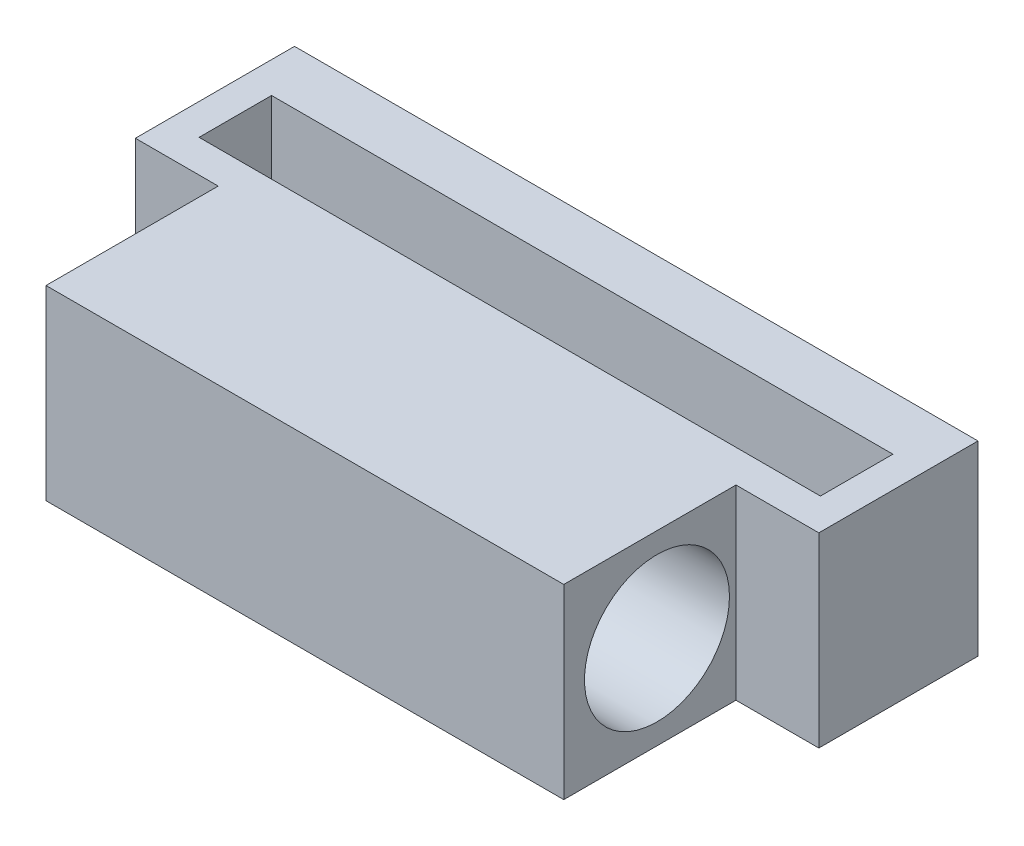
ISO-10303-21;
HEADER;
FILE_DESCRIPTION(('STEP AP214'),'2;1');
FILE_NAME('part.step','',(''),(''),'','','');
FILE_SCHEMA(('AUTOMOTIVE_DESIGN { 1 0 10303 214 1 1 1 1 }'));
ENDSEC;
DATA;
#1=APPLICATION_CONTEXT('core data for automotive mechanical design processes');
#2=APPLICATION_PROTOCOL_DEFINITION('international standard','automotive_design',2000,#1);
#3=PRODUCT_CONTEXT('',#1,'mechanical');
#4=PRODUCT('Part','Part','',(#3));
#5=PRODUCT_RELATED_PRODUCT_CATEGORY('part','',(#4));
#6=PRODUCT_DEFINITION_FORMATION('','',#4);
#7=PRODUCT_DEFINITION_CONTEXT('part definition',#1,'design');
#8=PRODUCT_DEFINITION('design','',#6,#7);
#9=PRODUCT_DEFINITION_SHAPE('','',#8);
#10=(LENGTH_UNIT() NAMED_UNIT(*) SI_UNIT(.MILLI.,.METRE.));
#11=(NAMED_UNIT(*) PLANE_ANGLE_UNIT() SI_UNIT($,.RADIAN.));
#12=(NAMED_UNIT(*) SI_UNIT($,.STERADIAN.) SOLID_ANGLE_UNIT());
#13=UNCERTAINTY_MEASURE_WITH_UNIT(LENGTH_MEASURE(1.E-05),#10,'distance_accuracy_value','');
#14=(GEOMETRIC_REPRESENTATION_CONTEXT(3) GLOBAL_UNCERTAINTY_ASSIGNED_CONTEXT((#13)) GLOBAL_UNIT_ASSIGNED_CONTEXT((#10,
#11,#12)) REPRESENTATION_CONTEXT('',''));
#15=CARTESIAN_POINT('',(0.,0.,0.));
#16=DIRECTION('',(0.,0.,1.));
#17=DIRECTION('',(1.,0.,0.));
#18=AXIS2_PLACEMENT_3D('',#15,#16,#17);
#19=CARTESIAN_POINT('',(0.,9.,0.));
#20=DIRECTION('',(1.,0.,0.));
#21=DIRECTION('',(0.,0.,-1.));
#22=AXIS2_PLACEMENT_3D('',#19,#20,#21);
#23=PLANE('',#22);
#24=CARTESIAN_POINT('',(0.,4.5,-4.5));
#25=DIRECTION('',(1.,0.,0.));
#26=DIRECTION('',(0.,0.,-1.));
#27=AXIS2_PLACEMENT_3D('',#24,#25,#26);
#28=CIRCLE('',#27,3.5);
#29=CARTESIAN_POINT('',(0.,4.5,-8.));
#30=VERTEX_POINT('',#29);
#31=EDGE_CURVE('E194',#30,#30,#28,.T.);
#32=ORIENTED_EDGE('',*,*,#31,.T.);
#33=EDGE_LOOP('',(#32));
#34=FACE_BOUND('',#33,.T.);
#35=DIRECTION('',(0.,0.,1.));
#36=VECTOR('',#35,1.);
#37=CARTESIAN_POINT('',(0.,9.,0.));
#38=LINE('',#37,#36);
#39=CARTESIAN_POINT('',(0.,9.,-8.31499990127327));
#40=VERTEX_POINT('',#39);
#41=CARTESIAN_POINT('',(0.,9.,0.));
#42=VERTEX_POINT('',#41);
#43=EDGE_CURVE('E200',#40,#42,#38,.T.);
#44=ORIENTED_EDGE('',*,*,#43,.F.);
#45=DIRECTION('',(0.,-1.,0.));
#46=VECTOR('',#45,1.);
#47=CARTESIAN_POINT('',(0.,9.,-8.31499990127327));
#48=LINE('',#47,#46);
#49=CARTESIAN_POINT('',(0.,0.,-8.31499990127327));
#50=VERTEX_POINT('',#49);
#51=EDGE_CURVE('E190',#40,#50,#48,.T.);
#52=ORIENTED_EDGE('',*,*,#51,.T.);
#53=DIRECTION('',(0.,0.,1.));
#54=VECTOR('',#53,1.);
#55=CARTESIAN_POINT('',(0.,0.,0.));
#56=LINE('',#55,#54);
#57=CARTESIAN_POINT('',(0.,0.,0.));
#58=VERTEX_POINT('',#57);
#59=EDGE_CURVE('E197',#50,#58,#56,.T.);
#60=ORIENTED_EDGE('',*,*,#59,.T.);
#61=DIRECTION('',(0.,-1.,0.));
#62=VECTOR('',#61,1.);
#63=CARTESIAN_POINT('',(0.,9.,0.));
#64=LINE('',#63,#62);
#65=EDGE_CURVE('E11',#42,#58,#64,.T.);
#66=ORIENTED_EDGE('',*,*,#65,.F.);
#67=EDGE_LOOP('',(#44,#52,#60,#66));
#68=FACE_BOUND('',#67,.T.);
#69=ADVANCED_FACE('F32',(#34,#68),#23,.F.);
#70=CARTESIAN_POINT('',(0.,9.,0.));
#71=DIRECTION('',(0.,0.,-1.));
#72=DIRECTION('',(-1.,0.,0.));
#73=AXIS2_PLACEMENT_3D('',#70,#71,#72);
#74=PLANE('',#73);
#75=DIRECTION('',(1.,0.,0.));
#76=VECTOR('',#75,1.);
#77=CARTESIAN_POINT('',(0.,0.,0.));
#78=LINE('',#77,#76);
#79=CARTESIAN_POINT('',(25.,0.,0.));
#80=VERTEX_POINT('',#79);
#81=EDGE_CURVE('E211',#58,#80,#78,.T.);
#82=ORIENTED_EDGE('',*,*,#81,.T.);
#83=DIRECTION('',(0.,-1.,0.));
#84=VECTOR('',#83,1.);
#85=CARTESIAN_POINT('',(25.,9.,0.));
#86=LINE('',#85,#84);
#87=CARTESIAN_POINT('',(25.,9.,0.));
#88=VERTEX_POINT('',#87);
#89=EDGE_CURVE('E39',#88,#80,#86,.T.);
#90=ORIENTED_EDGE('',*,*,#89,.F.);
#91=DIRECTION('',(1.,0.,0.));
#92=VECTOR('',#91,1.);
#93=CARTESIAN_POINT('',(0.,9.,0.));
#94=LINE('',#93,#92);
#95=EDGE_CURVE('E202',#42,#88,#94,.T.);
#96=ORIENTED_EDGE('',*,*,#95,.F.);
#97=ORIENTED_EDGE('',*,*,#65,.T.);
#98=EDGE_LOOP('',(#82,#90,#96,#97));
#99=FACE_BOUND('',#98,.T.);
#100=ADVANCED_FACE('F235',(#99),#74,.F.);
#101=CARTESIAN_POINT('',(25.,9.,0.));
#102=DIRECTION('',(-1.,0.,0.));
#103=DIRECTION('',(0.,0.,1.));
#104=AXIS2_PLACEMENT_3D('',#101,#102,#103);
#105=PLANE('',#104);
#106=CARTESIAN_POINT('',(25.,4.5,-4.5));
#107=DIRECTION('',(1.,0.,0.));
#108=DIRECTION('',(0.,0.,-1.));
#109=AXIS2_PLACEMENT_3D('',#106,#107,#108);
#110=CIRCLE('',#109,3.5);
#111=CARTESIAN_POINT('',(25.,4.5,-8.));
#112=VERTEX_POINT('',#111);
#113=EDGE_CURVE('E193',#112,#112,#110,.T.);
#114=ORIENTED_EDGE('',*,*,#113,.F.);
#115=EDGE_LOOP('',(#114));
#116=FACE_BOUND('',#115,.T.);
#117=DIRECTION('',(0.,0.,-1.));
#118=VECTOR('',#117,1.);
#119=CARTESIAN_POINT('',(25.,0.,0.));
#120=LINE('',#119,#118);
#121=CARTESIAN_POINT('',(25.,0.,-8.31499990127327));
#122=VERTEX_POINT('',#121);
#123=EDGE_CURVE('E213',#80,#122,#120,.T.);
#124=ORIENTED_EDGE('',*,*,#123,.T.);
#125=DIRECTION('',(0.,1.,0.));
#126=VECTOR('',#125,1.);
#127=CARTESIAN_POINT('',(25.,9.,-8.31499990127327));
#128=LINE('',#127,#126);
#129=CARTESIAN_POINT('',(25.,9.,-8.31499990127327));
#130=VERTEX_POINT('',#129);
#131=EDGE_CURVE('E184',#122,#130,#128,.T.);
#132=ORIENTED_EDGE('',*,*,#131,.T.);
#133=DIRECTION('',(0.,0.,-1.));
#134=VECTOR('',#133,1.);
#135=CARTESIAN_POINT('',(25.,9.,0.));
#136=LINE('',#135,#134);
#137=EDGE_CURVE('E205',#88,#130,#136,.T.);
#138=ORIENTED_EDGE('',*,*,#137,.F.);
#139=ORIENTED_EDGE('',*,*,#89,.T.);
#140=EDGE_LOOP('',(#124,#132,#138,#139));
#141=FACE_BOUND('',#140,.T.);
#142=ADVANCED_FACE('F220',(#116,#141),#105,.F.);
#143=CARTESIAN_POINT('',(0.,9.,-16.));
#144=DIRECTION('',(0.,0.,1.));
#145=DIRECTION('',(1.,0.,0.));
#146=AXIS2_PLACEMENT_3D('',#143,#144,#145);
#147=PLANE('',#146);
#148=DIRECTION('',(-1.,0.,0.));
#149=VECTOR('',#148,1.);
#150=CARTESIAN_POINT('',(0.,0.,-16.));
#151=LINE('',#150,#149);
#152=CARTESIAN_POINT('',(29.,0.,-16.));
#153=VERTEX_POINT('',#152);
#154=CARTESIAN_POINT('',(-4.,0.,-16.));
#155=VERTEX_POINT('',#154);
#156=EDGE_CURVE('E203',#153,#155,#151,.T.);
#157=ORIENTED_EDGE('',*,*,#156,.T.);
#158=DIRECTION('',(0.,1.,0.));
#159=VECTOR('',#158,1.);
#160=CARTESIAN_POINT('',(-4.,9.,-16.));
#161=LINE('',#160,#159);
#162=CARTESIAN_POINT('',(-4.,9.,-16.));
#163=VERTEX_POINT('',#162);
#164=EDGE_CURVE('E174',#155,#163,#161,.T.);
#165=ORIENTED_EDGE('',*,*,#164,.T.);
#166=DIRECTION('',(-1.,0.,0.));
#167=VECTOR('',#166,1.);
#168=CARTESIAN_POINT('',(0.,9.,-16.));
#169=LINE('',#168,#167);
#170=CARTESIAN_POINT('',(29.,9.,-16.));
#171=VERTEX_POINT('',#170);
#172=EDGE_CURVE('E208',#171,#163,#169,.T.);
#173=ORIENTED_EDGE('',*,*,#172,.F.);
#174=DIRECTION('',(0.,1.,0.));
#175=VECTOR('',#174,1.);
#176=CARTESIAN_POINT('',(29.,9.,-16.));
#177=LINE('',#176,#175);
#178=EDGE_CURVE('E162',#153,#171,#177,.T.);
#179=ORIENTED_EDGE('',*,*,#178,.F.);
#180=EDGE_LOOP('',(#157,#165,#173,#179));
#181=FACE_BOUND('',#180,.T.);
#182=ADVANCED_FACE('F248',(#181),#147,.F.);
#183=CARTESIAN_POINT('',(0.,9.,0.));
#184=DIRECTION('',(0.,-1.,0.));
#185=DIRECTION('',(0.,0.,-1.));
#186=AXIS2_PLACEMENT_3D('',#183,#184,#185);
#187=PLANE('',#186);
#188=DIRECTION('',(1.,0.,0.));
#189=VECTOR('',#188,1.);
#190=CARTESIAN_POINT('',(-2.5,9.,-9.89084720660094));
#191=LINE('',#190,#189);
#192=CARTESIAN_POINT('',(-2.5,9.,-9.89084720660094));
#193=VERTEX_POINT('',#192);
#194=CARTESIAN_POINT('',(27.5,9.,-9.89084720660094));
#195=VERTEX_POINT('',#194);
#196=EDGE_CURVE('E147',#193,#195,#191,.T.);
#197=ORIENTED_EDGE('',*,*,#196,.F.);
#198=DIRECTION('',(0.,0.,1.));
#199=VECTOR('',#198,1.);
#200=CARTESIAN_POINT('',(-2.5,9.,-13.3908472066009));
#201=LINE('',#200,#199);
#202=CARTESIAN_POINT('',(-2.5,9.,-13.3908472066009));
#203=VERTEX_POINT('',#202);
#204=EDGE_CURVE('E46',#203,#193,#201,.T.);
#205=ORIENTED_EDGE('',*,*,#204,.F.);
#206=DIRECTION('',(-1.,0.,0.));
#207=VECTOR('',#206,1.);
#208=CARTESIAN_POINT('',(-2.5,9.,-13.3908472066009));
#209=LINE('',#208,#207);
#210=CARTESIAN_POINT('',(27.5,9.,-13.3908472066009));
#211=VERTEX_POINT('',#210);
#212=EDGE_CURVE('E138',#211,#203,#209,.T.);
#213=ORIENTED_EDGE('',*,*,#212,.F.);
#214=DIRECTION('',(0.,0.,-1.));
#215=VECTOR('',#214,1.);
#216=CARTESIAN_POINT('',(27.5,9.,-13.3908472066009));
#217=LINE('',#216,#215);
#218=EDGE_CURVE('E141',#195,#211,#217,.T.);
#219=ORIENTED_EDGE('',*,*,#218,.F.);
#220=EDGE_LOOP('',(#197,#205,#213,#219));
#221=FACE_BOUND('',#220,.T.);
#222=ORIENTED_EDGE('',*,*,#137,.T.);
#223=DIRECTION('',(1.,0.,0.));
#224=VECTOR('',#223,1.);
#225=CARTESIAN_POINT('',(-4.,9.,-8.31499990127327));
#226=LINE('',#225,#224);
#227=CARTESIAN_POINT('',(29.,9.,-8.31499990127327));
#228=VERTEX_POINT('',#227);
#229=EDGE_CURVE('E185',#130,#228,#226,.T.);
#230=ORIENTED_EDGE('',*,*,#229,.T.);
#231=DIRECTION('',(0.,0.,1.));
#232=VECTOR('',#231,1.);
#233=CARTESIAN_POINT('',(29.,9.,-8.31499990127327));
#234=LINE('',#233,#232);
#235=EDGE_CURVE('E165',#171,#228,#234,.T.);
#236=ORIENTED_EDGE('',*,*,#235,.F.);
#237=ORIENTED_EDGE('',*,*,#172,.T.);
#238=DIRECTION('',(0.,0.,1.));
#239=VECTOR('',#238,1.);
#240=CARTESIAN_POINT('',(-4.,9.,-8.31499990127327));
#241=LINE('',#240,#239);
#242=CARTESIAN_POINT('',(-4.,9.,-8.31499990127327));
#243=VERTEX_POINT('',#242);
#244=EDGE_CURVE('E177',#163,#243,#241,.T.);
#245=ORIENTED_EDGE('',*,*,#244,.T.);
#246=EDGE_CURVE('E181',#243,#40,#226,.T.);
#247=ORIENTED_EDGE('',*,*,#246,.T.);
#248=ORIENTED_EDGE('',*,*,#43,.T.);
#249=ORIENTED_EDGE('',*,*,#95,.T.);
#250=EDGE_LOOP('',(#222,#230,#236,#237,#245,#247,#248,#249));
#251=FACE_BOUND('',#250,.T.);
#252=ADVANCED_FACE('F232',(#221,#251),#187,.F.);
#253=CARTESIAN_POINT('',(0.,0.,0.));
#254=DIRECTION('',(0.,-1.,0.));
#255=DIRECTION('',(0.,0.,-1.));
#256=AXIS2_PLACEMENT_3D('',#253,#254,#255);
#257=PLANE('',#256);
#258=DIRECTION('',(0.,0.,1.));
#259=VECTOR('',#258,1.);
#260=CARTESIAN_POINT('',(-2.5,0.,-13.3908472066009));
#261=LINE('',#260,#259);
#262=CARTESIAN_POINT('',(-2.5,0.,-13.3908472066009));
#263=VERTEX_POINT('',#262);
#264=CARTESIAN_POINT('',(-2.5,0.,-9.89084720660094));
#265=VERTEX_POINT('',#264);
#266=EDGE_CURVE('E122',#263,#265,#261,.T.);
#267=ORIENTED_EDGE('',*,*,#266,.T.);
#268=DIRECTION('',(1.,0.,0.));
#269=VECTOR('',#268,1.);
#270=CARTESIAN_POINT('',(-2.5,0.,-9.89084720660094));
#271=LINE('',#270,#269);
#272=CARTESIAN_POINT('',(27.5,0.,-9.89084720660094));
#273=VERTEX_POINT('',#272);
#274=EDGE_CURVE('E131',#265,#273,#271,.T.);
#275=ORIENTED_EDGE('',*,*,#274,.T.);
#276=DIRECTION('',(0.,0.,-1.));
#277=VECTOR('',#276,1.);
#278=CARTESIAN_POINT('',(27.5,0.,-13.3908472066009));
#279=LINE('',#278,#277);
#280=CARTESIAN_POINT('',(27.5,0.,-13.3908472066009));
#281=VERTEX_POINT('',#280);
#282=EDGE_CURVE('E54',#273,#281,#279,.T.);
#283=ORIENTED_EDGE('',*,*,#282,.T.);
#284=DIRECTION('',(-1.,0.,0.));
#285=VECTOR('',#284,1.);
#286=CARTESIAN_POINT('',(-2.5,0.,-13.3908472066009));
#287=LINE('',#286,#285);
#288=EDGE_CURVE('E128',#281,#263,#287,.T.);
#289=ORIENTED_EDGE('',*,*,#288,.T.);
#290=EDGE_LOOP('',(#267,#275,#283,#289));
#291=FACE_BOUND('',#290,.T.);
#292=ORIENTED_EDGE('',*,*,#59,.F.);
#293=DIRECTION('',(1.,0.,0.));
#294=VECTOR('',#293,1.);
#295=CARTESIAN_POINT('',(-4.,0.,-8.31499990127327));
#296=LINE('',#295,#294);
#297=CARTESIAN_POINT('',(-4.,0.,-8.31499990127327));
#298=VERTEX_POINT('',#297);
#299=EDGE_CURVE('E186',#298,#50,#296,.T.);
#300=ORIENTED_EDGE('',*,*,#299,.F.);
#301=DIRECTION('',(0.,0.,-1.));
#302=VECTOR('',#301,1.);
#303=CARTESIAN_POINT('',(-4.,0.,-8.31499990127327));
#304=LINE('',#303,#302);
#305=EDGE_CURVE('E171',#298,#155,#304,.T.);
#306=ORIENTED_EDGE('',*,*,#305,.T.);
#307=ORIENTED_EDGE('',*,*,#156,.F.);
#308=DIRECTION('',(0.,0.,-1.));
#309=VECTOR('',#308,1.);
#310=CARTESIAN_POINT('',(29.,0.,-8.31499990127327));
#311=LINE('',#310,#309);
#312=CARTESIAN_POINT('',(29.,0.,-8.31499990127327));
#313=VERTEX_POINT('',#312);
#314=EDGE_CURVE('E159',#313,#153,#311,.T.);
#315=ORIENTED_EDGE('',*,*,#314,.F.);
#316=EDGE_CURVE('E180',#122,#313,#296,.T.);
#317=ORIENTED_EDGE('',*,*,#316,.F.);
#318=ORIENTED_EDGE('',*,*,#123,.F.);
#319=ORIENTED_EDGE('',*,*,#81,.F.);
#320=EDGE_LOOP('',(#292,#300,#306,#307,#315,#317,#318,#319));
#321=FACE_BOUND('',#320,.T.);
#322=ADVANCED_FACE('F135',(#291,#321),#257,.T.);
#323=CARTESIAN_POINT('',(0.,4.5,-4.5));
#324=DIRECTION('',(1.,0.,0.));
#325=DIRECTION('',(0.,0.,-1.));
#326=AXIS2_PLACEMENT_3D('',#323,#324,#325);
#327=CYLINDRICAL_SURFACE('',#326,3.5);
#328=ORIENTED_EDGE('',*,*,#31,.F.);
#329=EDGE_LOOP('',(#328));
#330=FACE_BOUND('',#329,.T.);
#331=ORIENTED_EDGE('',*,*,#113,.T.);
#332=EDGE_LOOP('',(#331));
#333=FACE_BOUND('',#332,.T.);
#334=ADVANCED_FACE('F252',(#330,#333),#327,.F.);
#335=CARTESIAN_POINT('',(29.,0.,0.));
#336=DIRECTION('',(1.,0.,0.));
#337=DIRECTION('',(0.,0.,-1.));
#338=AXIS2_PLACEMENT_3D('',#335,#336,#337);
#339=PLANE('',#338);
#340=DIRECTION('',(0.,-1.,0.));
#341=VECTOR('',#340,1.);
#342=CARTESIAN_POINT('',(29.,9.,-8.31499990127327));
#343=LINE('',#342,#341);
#344=EDGE_CURVE('E153',#228,#313,#343,.T.);
#345=ORIENTED_EDGE('',*,*,#344,.T.);
#346=ORIENTED_EDGE('',*,*,#314,.T.);
#347=ORIENTED_EDGE('',*,*,#178,.T.);
#348=ORIENTED_EDGE('',*,*,#235,.T.);
#349=EDGE_LOOP('',(#345,#346,#347,#348));
#350=FACE_BOUND('',#349,.T.);
#351=ADVANCED_FACE('F250',(#350),#339,.T.);
#352=CARTESIAN_POINT('',(-4.,9.,-8.31499990127327));
#353=DIRECTION('',(0.,0.,1.));
#354=DIRECTION('',(1.,0.,0.));
#355=AXIS2_PLACEMENT_3D('',#352,#353,#354);
#356=PLANE('',#355);
#357=ORIENTED_EDGE('',*,*,#131,.F.);
#358=ORIENTED_EDGE('',*,*,#316,.T.);
#359=ORIENTED_EDGE('',*,*,#344,.F.);
#360=ORIENTED_EDGE('',*,*,#229,.F.);
#361=EDGE_LOOP('',(#357,#358,#359,#360));
#362=FACE_BOUND('',#361,.T.);
#363=ADVANCED_FACE('F229',(#362),#356,.T.);
#364=ORIENTED_EDGE('',*,*,#51,.F.);
#365=ORIENTED_EDGE('',*,*,#246,.F.);
#366=DIRECTION('',(0.,-1.,0.));
#367=VECTOR('',#366,1.);
#368=CARTESIAN_POINT('',(-4.,9.,-8.31499990127327));
#369=LINE('',#368,#367);
#370=EDGE_CURVE('E168',#243,#298,#369,.T.);
#371=ORIENTED_EDGE('',*,*,#370,.T.);
#372=ORIENTED_EDGE('',*,*,#299,.T.);
#373=EDGE_LOOP('',(#364,#365,#371,#372));
#374=FACE_BOUND('',#373,.T.);
#375=ADVANCED_FACE('F245',(#374),#356,.T.);
#376=CARTESIAN_POINT('',(-4.,0.,0.));
#377=DIRECTION('',(1.,0.,0.));
#378=DIRECTION('',(0.,0.,-1.));
#379=AXIS2_PLACEMENT_3D('',#376,#377,#378);
#380=PLANE('',#379);
#381=ORIENTED_EDGE('',*,*,#370,.F.);
#382=ORIENTED_EDGE('',*,*,#244,.F.);
#383=ORIENTED_EDGE('',*,*,#164,.F.);
#384=ORIENTED_EDGE('',*,*,#305,.F.);
#385=EDGE_LOOP('',(#381,#382,#383,#384));
#386=FACE_BOUND('',#385,.T.);
#387=ADVANCED_FACE('F243',(#386),#380,.F.);
#388=CARTESIAN_POINT('',(-2.5,0.,-13.3908472066009));
#389=DIRECTION('',(-1.,0.,0.));
#390=DIRECTION('',(0.,0.,1.));
#391=AXIS2_PLACEMENT_3D('',#388,#389,#390);
#392=PLANE('',#391);
#393=ORIENTED_EDGE('',*,*,#204,.T.);
#394=DIRECTION('',(0.,1.,0.));
#395=VECTOR('',#394,1.);
#396=CARTESIAN_POINT('',(-2.5,0.,-9.89084720660094));
#397=LINE('',#396,#395);
#398=EDGE_CURVE('E118',#265,#193,#397,.T.);
#399=ORIENTED_EDGE('',*,*,#398,.F.);
#400=ORIENTED_EDGE('',*,*,#266,.F.);
#401=DIRECTION('',(0.,1.,0.));
#402=VECTOR('',#401,1.);
#403=CARTESIAN_POINT('',(-2.5,0.,-13.3908472066009));
#404=LINE('',#403,#402);
#405=EDGE_CURVE('E151',#263,#203,#404,.T.);
#406=ORIENTED_EDGE('',*,*,#405,.T.);
#407=EDGE_LOOP('',(#393,#399,#400,#406));
#408=FACE_BOUND('',#407,.T.);
#409=ADVANCED_FACE('F120',(#408),#392,.F.);
#410=CARTESIAN_POINT('',(-2.5,0.,-13.3908472066009));
#411=DIRECTION('',(0.,0.,-1.));
#412=DIRECTION('',(-1.,0.,0.));
#413=AXIS2_PLACEMENT_3D('',#410,#411,#412);
#414=PLANE('',#413);
#415=ORIENTED_EDGE('',*,*,#212,.T.);
#416=ORIENTED_EDGE('',*,*,#405,.F.);
#417=ORIENTED_EDGE('',*,*,#288,.F.);
#418=DIRECTION('',(0.,1.,0.));
#419=VECTOR('',#418,1.);
#420=CARTESIAN_POINT('',(27.5,0.,-13.3908472066009));
#421=LINE('',#420,#419);
#422=EDGE_CURVE('E154',#281,#211,#421,.T.);
#423=ORIENTED_EDGE('',*,*,#422,.T.);
#424=EDGE_LOOP('',(#415,#416,#417,#423));
#425=FACE_BOUND('',#424,.T.);
#426=ADVANCED_FACE('F288',(#425),#414,.F.);
#427=CARTESIAN_POINT('',(27.5,0.,-13.3908472066009));
#428=DIRECTION('',(1.,0.,0.));
#429=DIRECTION('',(0.,0.,-1.));
#430=AXIS2_PLACEMENT_3D('',#427,#428,#429);
#431=PLANE('',#430);
#432=ORIENTED_EDGE('',*,*,#218,.T.);
#433=ORIENTED_EDGE('',*,*,#422,.F.);
#434=ORIENTED_EDGE('',*,*,#282,.F.);
#435=DIRECTION('',(0.,1.,0.));
#436=VECTOR('',#435,1.);
#437=CARTESIAN_POINT('',(27.5,0.,-9.89084720660094));
#438=LINE('',#437,#436);
#439=EDGE_CURVE('E127',#273,#195,#438,.T.);
#440=ORIENTED_EDGE('',*,*,#439,.T.);
#441=EDGE_LOOP('',(#432,#433,#434,#440));
#442=FACE_BOUND('',#441,.T.);
#443=ADVANCED_FACE('F292',(#442),#431,.F.);
#444=CARTESIAN_POINT('',(-2.5,0.,-9.89084720660094));
#445=DIRECTION('',(0.,0.,1.));
#446=DIRECTION('',(1.,0.,0.));
#447=AXIS2_PLACEMENT_3D('',#444,#445,#446);
#448=PLANE('',#447);
#449=ORIENTED_EDGE('',*,*,#196,.T.);
#450=ORIENTED_EDGE('',*,*,#439,.F.);
#451=ORIENTED_EDGE('',*,*,#274,.F.);
#452=ORIENTED_EDGE('',*,*,#398,.T.);
#453=EDGE_LOOP('',(#449,#450,#451,#452));
#454=FACE_BOUND('',#453,.T.);
#455=ADVANCED_FACE('F132',(#454),#448,.F.);
#456=CLOSED_SHELL('',(#69,#100,#142,#182,#252,#322,#334,#351,#363,#375,#387,#409,#426,#443,#455));
#457=MANIFOLD_SOLID_BREP('B2',#456);
#458=ADVANCED_BREP_SHAPE_REPRESENTATION('',(#18,#457),#14);
#459=SHAPE_DEFINITION_REPRESENTATION(#9,#458);
ENDSEC;
END-ISO-10303-21;
